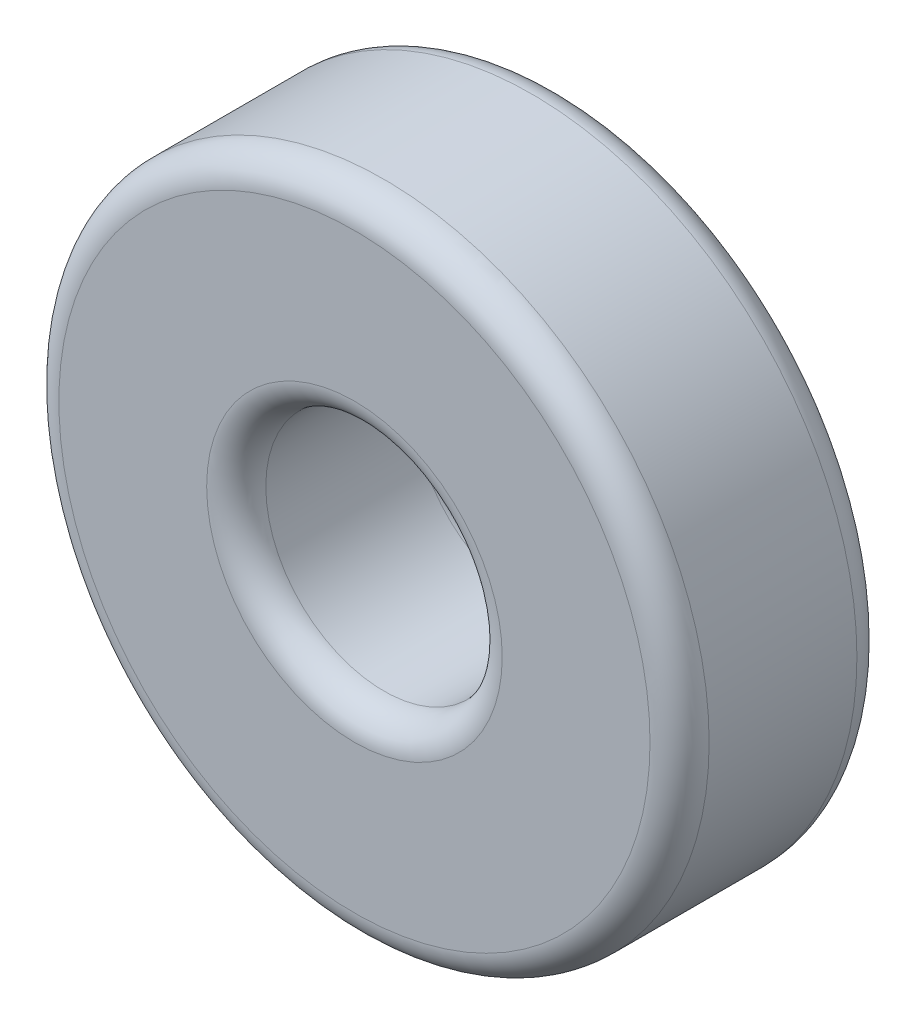
ISO-10303-21;
HEADER;
FILE_DESCRIPTION(('STEP AP214'),'2;1');
FILE_NAME('part.step','',(''),(''),'','','');
FILE_SCHEMA(('AUTOMOTIVE_DESIGN { 1 0 10303 214 1 1 1 1 }'));
ENDSEC;
DATA;
#1=APPLICATION_CONTEXT('core data for automotive mechanical design processes');
#2=APPLICATION_PROTOCOL_DEFINITION('international standard','automotive_design',2000,#1);
#3=PRODUCT_CONTEXT('',#1,'mechanical');
#4=PRODUCT('Part','Part','',(#3));
#5=PRODUCT_RELATED_PRODUCT_CATEGORY('part','',(#4));
#6=PRODUCT_DEFINITION_FORMATION('','',#4);
#7=PRODUCT_DEFINITION_CONTEXT('part definition',#1,'design');
#8=PRODUCT_DEFINITION('design','',#6,#7);
#9=PRODUCT_DEFINITION_SHAPE('','',#8);
#10=(LENGTH_UNIT() NAMED_UNIT(*) SI_UNIT(.MILLI.,.METRE.));
#11=(NAMED_UNIT(*) PLANE_ANGLE_UNIT() SI_UNIT($,.RADIAN.));
#12=(NAMED_UNIT(*) SI_UNIT($,.STERADIAN.) SOLID_ANGLE_UNIT());
#13=UNCERTAINTY_MEASURE_WITH_UNIT(LENGTH_MEASURE(1.E-05),#10,'distance_accuracy_value','');
#14=(GEOMETRIC_REPRESENTATION_CONTEXT(3) GLOBAL_UNCERTAINTY_ASSIGNED_CONTEXT((#13)) GLOBAL_UNIT_ASSIGNED_CONTEXT((#10,
#11,#12)) REPRESENTATION_CONTEXT('',''));
#15=CARTESIAN_POINT('',(0.,0.,0.));
#16=DIRECTION('',(0.,0.,1.));
#17=DIRECTION('',(1.,0.,0.));
#18=AXIS2_PLACEMENT_3D('',#15,#16,#17);
#19=CARTESIAN_POINT('',(0.,0.,7.));
#20=DIRECTION('',(0.,0.,1.));
#21=DIRECTION('',(1.,0.,0.));
#22=AXIS2_PLACEMENT_3D('',#19,#20,#21);
#23=PLANE('',#22);
#24=CARTESIAN_POINT('',(0.,0.,7.));
#25=DIRECTION('',(0.,0.,1.));
#26=DIRECTION('',(1.,0.,0.));
#27=AXIS2_PLACEMENT_3D('',#24,#25,#26);
#28=CIRCLE('',#27,5.);
#29=CARTESIAN_POINT('',(5.,0.,7.));
#30=VERTEX_POINT('',#29);
#31=EDGE_CURVE('E10',#30,#30,#28,.F.);
#32=ORIENTED_EDGE('',*,*,#31,.T.);
#33=EDGE_LOOP('',(#32));
#34=FACE_BOUND('',#33,.T.);
#35=CARTESIAN_POINT('',(0.,0.,7.));
#36=DIRECTION('',(0.,0.,1.));
#37=DIRECTION('',(1.,0.,0.));
#38=AXIS2_PLACEMENT_3D('',#35,#36,#37);
#39=CIRCLE('',#38,10.);
#40=CARTESIAN_POINT('',(10.,0.,7.));
#41=VERTEX_POINT('',#40);
#42=EDGE_CURVE('E43',#41,#41,#39,.T.);
#43=ORIENTED_EDGE('',*,*,#42,.T.);
#44=EDGE_LOOP('',(#43));
#45=FACE_BOUND('',#44,.T.);
#46=ADVANCED_FACE('F36',(#34,#45),#23,.T.);
#47=CARTESIAN_POINT('',(0.,0.,0.));
#48=DIRECTION('',(0.,0.,1.));
#49=DIRECTION('',(1.,0.,0.));
#50=AXIS2_PLACEMENT_3D('',#47,#48,#49);
#51=PLANE('',#50);
#52=CARTESIAN_POINT('',(0.,0.,0.));
#53=DIRECTION('',(0.,0.,1.));
#54=DIRECTION('',(1.,0.,0.));
#55=AXIS2_PLACEMENT_3D('',#52,#53,#54);
#56=CIRCLE('',#55,5.);
#57=CARTESIAN_POINT('',(5.,0.,0.));
#58=VERTEX_POINT('',#57);
#59=EDGE_CURVE('E62',#58,#58,#56,.T.);
#60=ORIENTED_EDGE('',*,*,#59,.T.);
#61=EDGE_LOOP('',(#60));
#62=FACE_BOUND('',#61,.T.);
#63=CARTESIAN_POINT('',(0.,0.,0.));
#64=DIRECTION('',(0.,0.,1.));
#65=DIRECTION('',(1.,0.,0.));
#66=AXIS2_PLACEMENT_3D('',#63,#64,#65);
#67=CIRCLE('',#66,10.);
#68=CARTESIAN_POINT('',(10.,0.,0.));
#69=VERTEX_POINT('',#68);
#70=EDGE_CURVE('E65',#69,#69,#67,.F.);
#71=ORIENTED_EDGE('',*,*,#70,.T.);
#72=EDGE_LOOP('',(#71));
#73=FACE_BOUND('',#72,.T.);
#74=ADVANCED_FACE('F69',(#62,#73),#51,.F.);
#75=CARTESIAN_POINT('',(0.,0.,7.));
#76=DIRECTION('',(0.,0.,-1.));
#77=DIRECTION('',(-1.,0.,0.));
#78=AXIS2_PLACEMENT_3D('',#75,#76,#77);
#79=CYLINDRICAL_SURFACE('',#78,11.);
#80=CARTESIAN_POINT('',(0.,0.,1.));
#81=DIRECTION('',(0.,0.,1.));
#82=DIRECTION('',(1.,0.,0.));
#83=AXIS2_PLACEMENT_3D('',#80,#81,#82);
#84=CIRCLE('',#83,11.);
#85=CARTESIAN_POINT('',(11.,0.,1.));
#86=VERTEX_POINT('',#85);
#87=EDGE_CURVE('E47',#86,#86,#84,.T.);
#88=ORIENTED_EDGE('',*,*,#87,.T.);
#89=EDGE_LOOP('',(#88));
#90=FACE_BOUND('',#89,.T.);
#91=CARTESIAN_POINT('',(0.,0.,6.));
#92=DIRECTION('',(0.,0.,1.));
#93=DIRECTION('',(1.,0.,0.));
#94=AXIS2_PLACEMENT_3D('',#91,#92,#93);
#95=CIRCLE('',#94,11.);
#96=CARTESIAN_POINT('',(11.,0.,6.));
#97=VERTEX_POINT('',#96);
#98=EDGE_CURVE('E51',#97,#97,#95,.F.);
#99=ORIENTED_EDGE('',*,*,#98,.T.);
#100=EDGE_LOOP('',(#99));
#101=FACE_BOUND('',#100,.T.);
#102=ADVANCED_FACE('F79',(#90,#101),#79,.T.);
#103=CARTESIAN_POINT('',(0.,0.,7.));
#104=DIRECTION('',(0.,0.,-1.));
#105=DIRECTION('',(-1.,0.,0.));
#106=AXIS2_PLACEMENT_3D('',#103,#104,#105);
#107=CYLINDRICAL_SURFACE('',#106,4.);
#108=CARTESIAN_POINT('',(0.,0.,1.));
#109=DIRECTION('',(0.,0.,1.));
#110=DIRECTION('',(1.,0.,0.));
#111=AXIS2_PLACEMENT_3D('',#108,#109,#110);
#112=CIRCLE('',#111,4.);
#113=CARTESIAN_POINT('',(4.,0.,1.));
#114=VERTEX_POINT('',#113);
#115=EDGE_CURVE('E56',#114,#114,#112,.F.);
#116=ORIENTED_EDGE('',*,*,#115,.T.);
#117=EDGE_LOOP('',(#116));
#118=FACE_BOUND('',#117,.T.);
#119=CARTESIAN_POINT('',(0.,0.,6.));
#120=DIRECTION('',(0.,0.,1.));
#121=DIRECTION('',(1.,0.,0.));
#122=AXIS2_PLACEMENT_3D('',#119,#120,#121);
#123=CIRCLE('',#122,4.);
#124=CARTESIAN_POINT('',(4.,0.,6.));
#125=VERTEX_POINT('',#124);
#126=EDGE_CURVE('E59',#125,#125,#123,.T.);
#127=ORIENTED_EDGE('',*,*,#126,.T.);
#128=EDGE_LOOP('',(#127));
#129=FACE_BOUND('',#128,.T.);
#130=ADVANCED_FACE('F82',(#118,#129),#107,.F.);
#131=CARTESIAN_POINT('',(0.,0.,1.));
#132=DIRECTION('',(0.,0.,1.));
#133=DIRECTION('',(1.,0.,0.));
#134=AXIS2_PLACEMENT_3D('',#131,#132,#133);
#135=TOROIDAL_SURFACE('',#134,5.,1.);
#136=ORIENTED_EDGE('',*,*,#115,.F.);
#137=EDGE_LOOP('',(#136));
#138=FACE_BOUND('',#137,.T.);
#139=ORIENTED_EDGE('',*,*,#59,.F.);
#140=EDGE_LOOP('',(#139));
#141=FACE_BOUND('',#140,.T.);
#142=ADVANCED_FACE('F75',(#138,#141),#135,.T.);
#143=CARTESIAN_POINT('',(0.,0.,1.));
#144=DIRECTION('',(0.,0.,1.));
#145=DIRECTION('',(1.,0.,0.));
#146=AXIS2_PLACEMENT_3D('',#143,#144,#145);
#147=TOROIDAL_SURFACE('',#146,10.,1.);
#148=ORIENTED_EDGE('',*,*,#70,.F.);
#149=EDGE_LOOP('',(#148));
#150=FACE_BOUND('',#149,.T.);
#151=ORIENTED_EDGE('',*,*,#87,.F.);
#152=EDGE_LOOP('',(#151));
#153=FACE_BOUND('',#152,.T.);
#154=ADVANCED_FACE('F71',(#150,#153),#147,.T.);
#155=CARTESIAN_POINT('',(0.,0.,6.));
#156=DIRECTION('',(0.,0.,1.));
#157=DIRECTION('',(1.,0.,0.));
#158=AXIS2_PLACEMENT_3D('',#155,#156,#157);
#159=TOROIDAL_SURFACE('',#158,5.,1.);
#160=ORIENTED_EDGE('',*,*,#31,.F.);
#161=EDGE_LOOP('',(#160));
#162=FACE_BOUND('',#161,.T.);
#163=ORIENTED_EDGE('',*,*,#126,.F.);
#164=EDGE_LOOP('',(#163));
#165=FACE_BOUND('',#164,.T.);
#166=ADVANCED_FACE('F74',(#162,#165),#159,.T.);
#167=CARTESIAN_POINT('',(0.,0.,6.));
#168=DIRECTION('',(0.,0.,1.));
#169=DIRECTION('',(1.,0.,0.));
#170=AXIS2_PLACEMENT_3D('',#167,#168,#169);
#171=TOROIDAL_SURFACE('',#170,10.,1.);
#172=ORIENTED_EDGE('',*,*,#98,.F.);
#173=EDGE_LOOP('',(#172));
#174=FACE_BOUND('',#173,.T.);
#175=ORIENTED_EDGE('',*,*,#42,.F.);
#176=EDGE_LOOP('',(#175));
#177=FACE_BOUND('',#176,.T.);
#178=ADVANCED_FACE('F38',(#174,#177),#171,.T.);
#179=CLOSED_SHELL('',(#46,#74,#102,#130,#142,#154,#166,#178));
#180=MANIFOLD_SOLID_BREP('B2',#179);
#181=ADVANCED_BREP_SHAPE_REPRESENTATION('',(#18,#180),#14);
#182=SHAPE_DEFINITION_REPRESENTATION(#9,#181);
ENDSEC;
END-ISO-10303-21;
